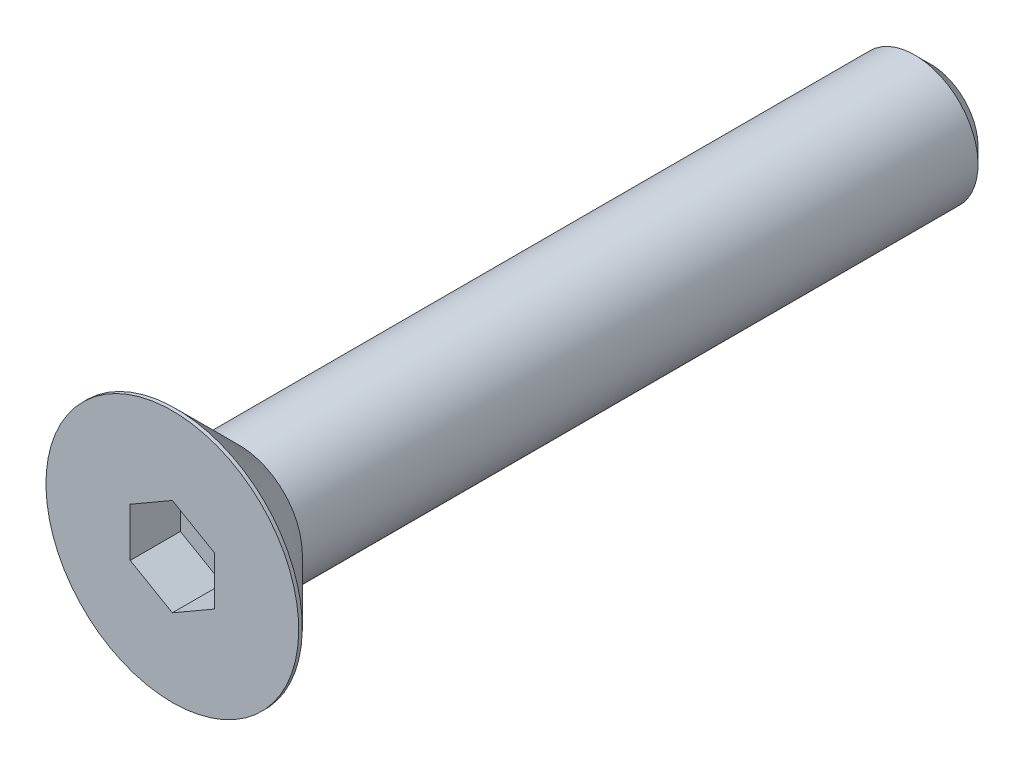
ISO-10303-21;
HEADER;
FILE_DESCRIPTION(('STEP AP214'),'2;1');
FILE_NAME('part.step','',(''),(''),'','','');
FILE_SCHEMA(('AUTOMOTIVE_DESIGN { 1 0 10303 214 1 1 1 1 }'));
ENDSEC;
DATA;
#1=APPLICATION_CONTEXT('core data for automotive mechanical design processes');
#2=APPLICATION_PROTOCOL_DEFINITION('international standard','automotive_design',2000,#1);
#3=PRODUCT_CONTEXT('',#1,'mechanical');
#4=PRODUCT('Part','Part','',(#3));
#5=PRODUCT_RELATED_PRODUCT_CATEGORY('part','',(#4));
#6=PRODUCT_DEFINITION_FORMATION('','',#4);
#7=PRODUCT_DEFINITION_CONTEXT('part definition',#1,'design');
#8=PRODUCT_DEFINITION('design','',#6,#7);
#9=PRODUCT_DEFINITION_SHAPE('','',#8);
#10=(LENGTH_UNIT() NAMED_UNIT(*) SI_UNIT(.MILLI.,.METRE.));
#11=(NAMED_UNIT(*) PLANE_ANGLE_UNIT() SI_UNIT($,.RADIAN.));
#12=(NAMED_UNIT(*) SI_UNIT($,.STERADIAN.) SOLID_ANGLE_UNIT());
#13=UNCERTAINTY_MEASURE_WITH_UNIT(LENGTH_MEASURE(1.E-05),#10,'distance_accuracy_value','');
#14=(GEOMETRIC_REPRESENTATION_CONTEXT(3) GLOBAL_UNCERTAINTY_ASSIGNED_CONTEXT((#13)) GLOBAL_UNIT_ASSIGNED_CONTEXT((#10,
#11,#12)) REPRESENTATION_CONTEXT('',''));
#15=CARTESIAN_POINT('',(0.,0.,0.));
#16=DIRECTION('',(0.,0.,1.));
#17=DIRECTION('',(1.,0.,0.));
#18=AXIS2_PLACEMENT_3D('',#15,#16,#17);
#19=CARTESIAN_POINT('',(0.,0.,8.915));
#20=DIRECTION('',(0.,0.,1.));
#21=DIRECTION('',(0.,-1.,0.));
#22=AXIS2_PLACEMENT_3D('',#19,#20,#21);
#23=CONICAL_SURFACE('',#22,3.,0.785398163397448);
#24=CARTESIAN_POINT('',(0.,0.,7.3));
#25=DIRECTION('',(0.,0.,1.));
#26=DIRECTION('',(0.,-1.,0.));
#27=AXIS2_PLACEMENT_3D('',#24,#25,#26);
#28=CIRCLE('',#27,1.385);
#29=CARTESIAN_POINT('',(0.,-1.385,7.3));
#30=VERTEX_POINT('',#29);
#31=EDGE_CURVE('E149',#30,#30,#28,.T.);
#32=ORIENTED_EDGE('',*,*,#31,.T.);
#33=EDGE_LOOP('',(#32));
#34=FACE_BOUND('',#33,.T.);
#35=CARTESIAN_POINT('',(0.,0.,8.915));
#36=DIRECTION('',(0.,0.,1.));
#37=DIRECTION('',(0.,-1.,0.));
#38=AXIS2_PLACEMENT_3D('',#35,#36,#37);
#39=CIRCLE('',#38,3.);
#40=CARTESIAN_POINT('',(0.,-3.,8.915));
#41=VERTEX_POINT('',#40);
#42=EDGE_CURVE('E12',#41,#41,#39,.T.);
#43=ORIENTED_EDGE('',*,*,#42,.F.);
#44=EDGE_LOOP('',(#43));
#45=FACE_BOUND('',#44,.T.);
#46=ADVANCED_FACE('F48',(#34,#45),#23,.T.);
#47=CARTESIAN_POINT('',(0.,0.,9.));
#48=DIRECTION('',(0.,0.,1.));
#49=DIRECTION('',(0.,-1.,0.));
#50=AXIS2_PLACEMENT_3D('',#47,#48,#49);
#51=CYLINDRICAL_SURFACE('',#50,3.);
#52=ORIENTED_EDGE('',*,*,#42,.T.);
#53=EDGE_LOOP('',(#52));
#54=FACE_BOUND('',#53,.T.);
#55=CARTESIAN_POINT('',(0.,0.,9.));
#56=DIRECTION('',(0.,0.,1.));
#57=DIRECTION('',(0.,-1.,0.));
#58=AXIS2_PLACEMENT_3D('',#55,#56,#57);
#59=CIRCLE('',#58,3.);
#60=CARTESIAN_POINT('',(0.,-3.,9.));
#61=VERTEX_POINT('',#60);
#62=EDGE_CURVE('E55',#61,#61,#59,.T.);
#63=ORIENTED_EDGE('',*,*,#62,.F.);
#64=EDGE_LOOP('',(#63));
#65=FACE_BOUND('',#64,.T.);
#66=ADVANCED_FACE('F161',(#54,#65),#51,.T.);
#67=CARTESIAN_POINT('',(0.,0.,9.));
#68=DIRECTION('',(0.,0.,-1.));
#69=DIRECTION('',(0.,1.,0.));
#70=AXIS2_PLACEMENT_3D('',#67,#68,#69);
#71=PLANE('',#70);
#72=DIRECTION('',(0.,1.,0.));
#73=VECTOR('',#72,1.);
#74=CARTESIAN_POINT('',(1.,-0.577350269189627,9.));
#75=LINE('',#74,#73);
#76=CARTESIAN_POINT('',(1.,-0.577350269189627,9.));
#77=VERTEX_POINT('',#76);
#78=CARTESIAN_POINT('',(1.,0.577350269189625,9.));
#79=VERTEX_POINT('',#78);
#80=EDGE_CURVE('E136',#77,#79,#75,.T.);
#81=ORIENTED_EDGE('',*,*,#80,.F.);
#82=DIRECTION('',(0.866025403784438,0.5,0.));
#83=VECTOR('',#82,1.);
#84=CARTESIAN_POINT('',(0.,-1.15470053837925,9.));
#85=LINE('',#84,#83);
#86=CARTESIAN_POINT('',(0.,-1.15470053837925,9.));
#87=VERTEX_POINT('',#86);
#88=EDGE_CURVE('E62',#87,#77,#85,.T.);
#89=ORIENTED_EDGE('',*,*,#88,.F.);
#90=DIRECTION('',(0.866025403784439,-0.5,0.));
#91=VECTOR('',#90,1.);
#92=CARTESIAN_POINT('',(-1.,-0.577350269189628,9.));
#93=LINE('',#92,#91);
#94=CARTESIAN_POINT('',(-1.,-0.577350269189628,9.));
#95=VERTEX_POINT('',#94);
#96=EDGE_CURVE('E145',#95,#87,#93,.T.);
#97=ORIENTED_EDGE('',*,*,#96,.F.);
#98=DIRECTION('',(0.,-1.,0.));
#99=VECTOR('',#98,1.);
#100=CARTESIAN_POINT('',(-1.,0.577350269189625,9.));
#101=LINE('',#100,#99);
#102=CARTESIAN_POINT('',(-1.,0.577350269189625,9.));
#103=VERTEX_POINT('',#102);
#104=EDGE_CURVE('E143',#103,#95,#101,.T.);
#105=ORIENTED_EDGE('',*,*,#104,.F.);
#106=DIRECTION('',(-0.866025403784439,-0.5,0.));
#107=VECTOR('',#106,1.);
#108=CARTESIAN_POINT('',(0.,1.15470053837925,9.));
#109=LINE('',#108,#107);
#110=CARTESIAN_POINT('',(0.,1.15470053837925,9.));
#111=VERTEX_POINT('',#110);
#112=EDGE_CURVE('E110',#111,#103,#109,.T.);
#113=ORIENTED_EDGE('',*,*,#112,.F.);
#114=DIRECTION('',(-0.866025403784439,0.5,0.));
#115=VECTOR('',#114,1.);
#116=CARTESIAN_POINT('',(1.,0.577350269189625,9.));
#117=LINE('',#116,#115);
#118=EDGE_CURVE('E139',#79,#111,#117,.T.);
#119=ORIENTED_EDGE('',*,*,#118,.F.);
#120=EDGE_LOOP('',(#81,#89,#97,#105,#113,#119));
#121=FACE_BOUND('',#120,.T.);
#122=ORIENTED_EDGE('',*,*,#62,.T.);
#123=EDGE_LOOP('',(#122));
#124=FACE_BOUND('',#123,.T.);
#125=ADVANCED_FACE('F159',(#121,#124),#71,.F.);
#126=CARTESIAN_POINT('',(0.,0.,7.3));
#127=DIRECTION('',(0.,0.,-1.));
#128=DIRECTION('',(0.,1.,0.));
#129=AXIS2_PLACEMENT_3D('',#126,#127,#128);
#130=PLANE('',#129);
#131=ORIENTED_EDGE('',*,*,#31,.F.);
#132=EDGE_LOOP('',(#131));
#133=FACE_BOUND('',#132,.T.);
#134=ADVANCED_FACE('F168',(#133),#130,.T.);
#135=CARTESIAN_POINT('',(0.,-1.15470053837925,7.81));
#136=DIRECTION('',(0.5,-0.866025403784439,0.));
#137=DIRECTION('',(0.866025403784439,0.5,0.));
#138=AXIS2_PLACEMENT_3D('',#135,#136,#137);
#139=PLANE('',#138);
#140=ORIENTED_EDGE('',*,*,#88,.T.);
#141=DIRECTION('',(0.,0.,1.));
#142=VECTOR('',#141,1.);
#143=CARTESIAN_POINT('',(1.,-0.577350269189627,7.81));
#144=LINE('',#143,#142);
#145=CARTESIAN_POINT('',(1.,-0.577350269189627,7.81));
#146=VERTEX_POINT('',#145);
#147=EDGE_CURVE('E92',#146,#77,#144,.T.);
#148=ORIENTED_EDGE('',*,*,#147,.F.);
#149=DIRECTION('',(0.866025403784438,0.5,0.));
#150=VECTOR('',#149,1.);
#151=CARTESIAN_POINT('',(0.,-1.15470053837925,7.81));
#152=LINE('',#151,#150);
#153=CARTESIAN_POINT('',(0.,-1.15470053837925,7.81));
#154=VERTEX_POINT('',#153);
#155=EDGE_CURVE('E147',#154,#146,#152,.T.);
#156=ORIENTED_EDGE('',*,*,#155,.F.);
#157=DIRECTION('',(0.,0.,1.));
#158=VECTOR('',#157,1.);
#159=CARTESIAN_POINT('',(0.,-1.15470053837925,7.81));
#160=LINE('',#159,#158);
#161=EDGE_CURVE('E70',#154,#87,#160,.T.);
#162=ORIENTED_EDGE('',*,*,#161,.T.);
#163=EDGE_LOOP('',(#140,#148,#156,#162));
#164=FACE_BOUND('',#163,.T.);
#165=ADVANCED_FACE('F175',(#164),#139,.F.);
#166=CARTESIAN_POINT('',(-1.,-0.577350269189628,7.81));
#167=DIRECTION('',(-0.5,-0.866025403784439,0.));
#168=DIRECTION('',(0.866025403784439,-0.5,0.));
#169=AXIS2_PLACEMENT_3D('',#166,#167,#168);
#170=PLANE('',#169);
#171=ORIENTED_EDGE('',*,*,#96,.T.);
#172=ORIENTED_EDGE('',*,*,#161,.F.);
#173=DIRECTION('',(0.866025403784439,-0.5,0.));
#174=VECTOR('',#173,1.);
#175=CARTESIAN_POINT('',(-1.,-0.577350269189628,7.81));
#176=LINE('',#175,#174);
#177=CARTESIAN_POINT('',(-1.,-0.577350269189628,7.81));
#178=VERTEX_POINT('',#177);
#179=EDGE_CURVE('E122',#178,#154,#176,.T.);
#180=ORIENTED_EDGE('',*,*,#179,.F.);
#181=DIRECTION('',(0.,0.,1.));
#182=VECTOR('',#181,1.);
#183=CARTESIAN_POINT('',(-1.,-0.577350269189628,7.81));
#184=LINE('',#183,#182);
#185=EDGE_CURVE('E114',#178,#95,#184,.T.);
#186=ORIENTED_EDGE('',*,*,#185,.T.);
#187=EDGE_LOOP('',(#171,#172,#180,#186));
#188=FACE_BOUND('',#187,.T.);
#189=ADVANCED_FACE('F179',(#188),#170,.F.);
#190=CARTESIAN_POINT('',(-1.,0.577350269189625,7.81));
#191=DIRECTION('',(-1.,0.,0.));
#192=DIRECTION('',(0.,0.,1.));
#193=AXIS2_PLACEMENT_3D('',#190,#191,#192);
#194=PLANE('',#193);
#195=ORIENTED_EDGE('',*,*,#104,.T.);
#196=ORIENTED_EDGE('',*,*,#185,.F.);
#197=DIRECTION('',(0.,-1.,0.));
#198=VECTOR('',#197,1.);
#199=CARTESIAN_POINT('',(-1.,0.577350269189625,7.81));
#200=LINE('',#199,#198);
#201=CARTESIAN_POINT('',(-1.,0.577350269189625,7.81));
#202=VERTEX_POINT('',#201);
#203=EDGE_CURVE('E118',#202,#178,#200,.T.);
#204=ORIENTED_EDGE('',*,*,#203,.F.);
#205=DIRECTION('',(0.,0.,1.));
#206=VECTOR('',#205,1.);
#207=CARTESIAN_POINT('',(-1.,0.577350269189625,7.81));
#208=LINE('',#207,#206);
#209=EDGE_CURVE('E103',#202,#103,#208,.T.);
#210=ORIENTED_EDGE('',*,*,#209,.T.);
#211=EDGE_LOOP('',(#195,#196,#204,#210));
#212=FACE_BOUND('',#211,.T.);
#213=ADVANCED_FACE('F119',(#212),#194,.F.);
#214=CARTESIAN_POINT('',(0.,1.15470053837925,7.81));
#215=DIRECTION('',(-0.5,0.866025403784439,0.));
#216=DIRECTION('',(-0.866025403784439,-0.5,0.));
#217=AXIS2_PLACEMENT_3D('',#214,#215,#216);
#218=PLANE('',#217);
#219=ORIENTED_EDGE('',*,*,#112,.T.);
#220=ORIENTED_EDGE('',*,*,#209,.F.);
#221=DIRECTION('',(-0.866025403784439,-0.5,0.));
#222=VECTOR('',#221,1.);
#223=CARTESIAN_POINT('',(0.,1.15470053837925,7.81));
#224=LINE('',#223,#222);
#225=CARTESIAN_POINT('',(0.,1.15470053837925,7.81));
#226=VERTEX_POINT('',#225);
#227=EDGE_CURVE('E107',#226,#202,#224,.T.);
#228=ORIENTED_EDGE('',*,*,#227,.F.);
#229=DIRECTION('',(0.,0.,1.));
#230=VECTOR('',#229,1.);
#231=CARTESIAN_POINT('',(0.,1.15470053837925,7.81));
#232=LINE('',#231,#230);
#233=EDGE_CURVE('E115',#226,#111,#232,.T.);
#234=ORIENTED_EDGE('',*,*,#233,.T.);
#235=EDGE_LOOP('',(#219,#220,#228,#234));
#236=FACE_BOUND('',#235,.T.);
#237=ADVANCED_FACE('F105',(#236),#218,.F.);
#238=CARTESIAN_POINT('',(1.,0.577350269189625,7.81));
#239=DIRECTION('',(0.5,0.866025403784439,0.));
#240=DIRECTION('',(-0.866025403784439,0.5,0.));
#241=AXIS2_PLACEMENT_3D('',#238,#239,#240);
#242=PLANE('',#241);
#243=ORIENTED_EDGE('',*,*,#118,.T.);
#244=ORIENTED_EDGE('',*,*,#233,.F.);
#245=DIRECTION('',(-0.866025403784439,0.5,0.));
#246=VECTOR('',#245,1.);
#247=CARTESIAN_POINT('',(1.,0.577350269189625,7.81));
#248=LINE('',#247,#246);
#249=CARTESIAN_POINT('',(1.,0.577350269189625,7.81));
#250=VERTEX_POINT('',#249);
#251=EDGE_CURVE('E128',#250,#226,#248,.T.);
#252=ORIENTED_EDGE('',*,*,#251,.F.);
#253=DIRECTION('',(0.,0.,1.));
#254=VECTOR('',#253,1.);
#255=CARTESIAN_POINT('',(1.,0.577350269189625,7.81));
#256=LINE('',#255,#254);
#257=EDGE_CURVE('E152',#250,#79,#256,.T.);
#258=ORIENTED_EDGE('',*,*,#257,.T.);
#259=EDGE_LOOP('',(#243,#244,#252,#258));
#260=FACE_BOUND('',#259,.T.);
#261=ADVANCED_FACE('F183',(#260),#242,.F.);
#262=CARTESIAN_POINT('',(1.,-0.577350269189627,7.81));
#263=DIRECTION('',(1.,0.,0.));
#264=DIRECTION('',(0.,0.,-1.));
#265=AXIS2_PLACEMENT_3D('',#262,#263,#264);
#266=PLANE('',#265);
#267=ORIENTED_EDGE('',*,*,#80,.T.);
#268=ORIENTED_EDGE('',*,*,#257,.F.);
#269=DIRECTION('',(0.,1.,0.));
#270=VECTOR('',#269,1.);
#271=CARTESIAN_POINT('',(1.,-0.577350269189627,7.81));
#272=LINE('',#271,#270);
#273=EDGE_CURVE('E130',#146,#250,#272,.T.);
#274=ORIENTED_EDGE('',*,*,#273,.F.);
#275=ORIENTED_EDGE('',*,*,#147,.T.);
#276=EDGE_LOOP('',(#267,#268,#274,#275));
#277=FACE_BOUND('',#276,.T.);
#278=ADVANCED_FACE('F180',(#277),#266,.F.);
#279=CARTESIAN_POINT('',(1.,-0.577350269189627,7.81));
#280=DIRECTION('',(0.,0.,1.));
#281=DIRECTION('',(1.,0.,0.));
#282=AXIS2_PLACEMENT_3D('',#279,#280,#281);
#283=PLANE('',#282);
#284=ORIENTED_EDGE('',*,*,#155,.T.);
#285=ORIENTED_EDGE('',*,*,#273,.T.);
#286=ORIENTED_EDGE('',*,*,#251,.T.);
#287=ORIENTED_EDGE('',*,*,#227,.T.);
#288=ORIENTED_EDGE('',*,*,#203,.T.);
#289=ORIENTED_EDGE('',*,*,#179,.T.);
#290=EDGE_LOOP('',(#284,#285,#286,#287,#288,#289));
#291=FACE_BOUND('',#290,.T.);
#292=ADVANCED_FACE('F125',(#291),#283,.T.);
#293=CLOSED_SHELL('',(#46,#66,#125,#134,#165,#189,#213,#237,#261,#278,#292));
#294=MANIFOLD_SOLID_BREP('B2',#293);
#295=CARTESIAN_POINT('',(0.,-1.50000000000001,7.81000000000001));
#296=DIRECTION('',(0.,0.,-1.));
#297=DIRECTION('',(0.,1.,0.));
#298=AXIS2_PLACEMENT_3D('',#295,#296,#297);
#299=PLANE('',#298);
#300=CARTESIAN_POINT('',(0.,0.,7.81000000000001));
#301=DIRECTION('',(0.,0.,1.));
#302=DIRECTION('',(0.,-1.,0.));
#303=AXIS2_PLACEMENT_3D('',#300,#301,#302);
#304=CIRCLE('',#303,1.50000000000001);
#305=CARTESIAN_POINT('',(0.,-1.50000000000001,7.81000000000001));
#306=VERTEX_POINT('',#305);
#307=EDGE_CURVE('E281',#306,#306,#304,.T.);
#308=ORIENTED_EDGE('',*,*,#307,.T.);
#309=EDGE_LOOP('',(#308));
#310=FACE_BOUND('',#309,.T.);
#311=ADVANCED_FACE('F268',(#310),#299,.F.);
#312=CARTESIAN_POINT('',(0.,-1.5,-9.00000000000001));
#313=DIRECTION('',(0.,0.,1.));
#314=DIRECTION('',(0.,-1.,0.));
#315=AXIS2_PLACEMENT_3D('',#312,#313,#314);
#316=PLANE('',#315);
#317=CARTESIAN_POINT('',(0.,0.,-9.00000000000001));
#318=DIRECTION('',(0.,0.,1.));
#319=DIRECTION('',(0.,-1.,0.));
#320=AXIS2_PLACEMENT_3D('',#317,#318,#319);
#321=CIRCLE('',#320,1.125);
#322=CARTESIAN_POINT('',(0.,-1.125,-9.00000000000001));
#323=VERTEX_POINT('',#322);
#324=EDGE_CURVE('E47',#323,#323,#321,.F.);
#325=ORIENTED_EDGE('',*,*,#324,.T.);
#326=EDGE_LOOP('',(#325));
#327=FACE_BOUND('',#326,.T.);
#328=ADVANCED_FACE('F292',(#327),#316,.F.);
#329=CARTESIAN_POINT('',(0.,0.,7.81));
#330=DIRECTION('',(0.,0.,1.));
#331=DIRECTION('',(0.,-1.,0.));
#332=AXIS2_PLACEMENT_3D('',#329,#330,#331);
#333=CYLINDRICAL_SURFACE('',#332,1.50000000000001);
#334=CARTESIAN_POINT('',(0.,0.,-8.625));
#335=DIRECTION('',(0.,0.,1.));
#336=DIRECTION('',(0.,-1.,0.));
#337=AXIS2_PLACEMENT_3D('',#334,#335,#336);
#338=CIRCLE('',#337,1.50000000000001);
#339=CARTESIAN_POINT('',(0.,-1.50000000000001,-8.625));
#340=VERTEX_POINT('',#339);
#341=EDGE_CURVE('E276',#340,#340,#338,.T.);
#342=ORIENTED_EDGE('',*,*,#341,.T.);
#343=EDGE_LOOP('',(#342));
#344=FACE_BOUND('',#343,.T.);
#345=ORIENTED_EDGE('',*,*,#307,.F.);
#346=EDGE_LOOP('',(#345));
#347=FACE_BOUND('',#346,.T.);
#348=ADVANCED_FACE('F290',(#344,#347),#333,.T.);
#349=CARTESIAN_POINT('',(0.,0.,-8.625));
#350=DIRECTION('',(0.,0.,1.));
#351=DIRECTION('',(0.,-1.,0.));
#352=AXIS2_PLACEMENT_3D('',#349,#350,#351);
#353=CONICAL_SURFACE('',#352,1.50000000000001,0.78539816339745);
#354=ORIENTED_EDGE('',*,*,#324,.F.);
#355=EDGE_LOOP('',(#354));
#356=FACE_BOUND('',#355,.T.);
#357=ORIENTED_EDGE('',*,*,#341,.F.);
#358=EDGE_LOOP('',(#357));
#359=FACE_BOUND('',#358,.T.);
#360=ADVANCED_FACE('F270',(#356,#359),#353,.T.);
#361=CLOSED_SHELL('',(#311,#328,#348,#360));
#362=MANIFOLD_SOLID_BREP('B6',#361);
#363=ADVANCED_BREP_SHAPE_REPRESENTATION('',(#18,#294,#362),#14);
#364=SHAPE_DEFINITION_REPRESENTATION(#9,#363);
ENDSEC;
END-ISO-10303-21;
